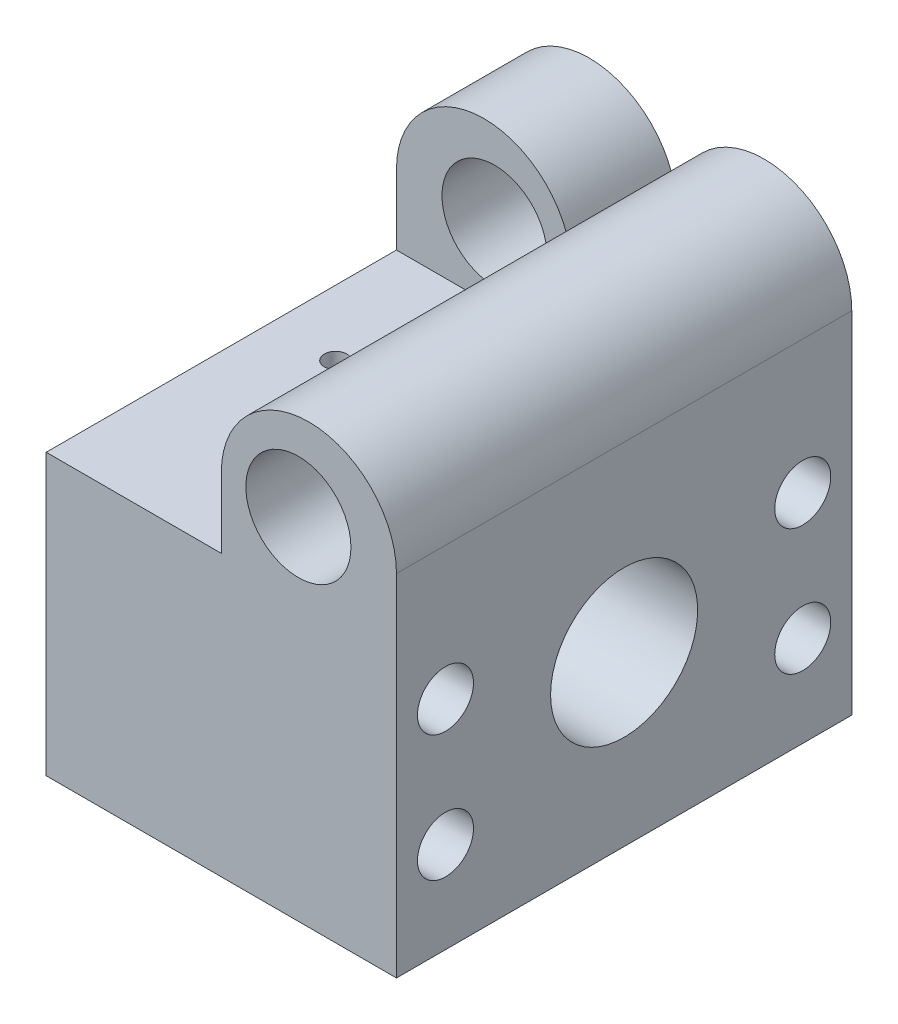
ISO-10303-21;
HEADER;
FILE_DESCRIPTION(('STEP AP214'),'2;1');
FILE_NAME('part.step','',(''),(''),'','','');
FILE_SCHEMA(('AUTOMOTIVE_DESIGN { 1 0 10303 214 1 1 1 1 }'));
ENDSEC;
DATA;
#1=APPLICATION_CONTEXT('core data for automotive mechanical design processes');
#2=APPLICATION_PROTOCOL_DEFINITION('international standard','automotive_design',2000,#1);
#3=PRODUCT_CONTEXT('',#1,'mechanical');
#4=PRODUCT('Part','Part','',(#3));
#5=PRODUCT_RELATED_PRODUCT_CATEGORY('part','',(#4));
#6=PRODUCT_DEFINITION_FORMATION('','',#4);
#7=PRODUCT_DEFINITION_CONTEXT('part definition',#1,'design');
#8=PRODUCT_DEFINITION('design','',#6,#7);
#9=PRODUCT_DEFINITION_SHAPE('','',#8);
#10=(LENGTH_UNIT() NAMED_UNIT(*) SI_UNIT(.MILLI.,.METRE.));
#11=(NAMED_UNIT(*) PLANE_ANGLE_UNIT() SI_UNIT($,.RADIAN.));
#12=(NAMED_UNIT(*) SI_UNIT($,.STERADIAN.) SOLID_ANGLE_UNIT());
#13=UNCERTAINTY_MEASURE_WITH_UNIT(LENGTH_MEASURE(1.E-05),#10,'distance_accuracy_value','');
#14=(GEOMETRIC_REPRESENTATION_CONTEXT(3) GLOBAL_UNCERTAINTY_ASSIGNED_CONTEXT((#13)) GLOBAL_UNIT_ASSIGNED_CONTEXT((#10,
#11,#12)) REPRESENTATION_CONTEXT('',''));
#15=CARTESIAN_POINT('',(0.,0.,0.));
#16=DIRECTION('',(0.,0.,1.));
#17=DIRECTION('',(1.,0.,0.));
#18=AXIS2_PLACEMENT_3D('',#15,#16,#17);
#19=CARTESIAN_POINT('',(50.,24.,32.5));
#20=DIRECTION('',(-1.,0.,0.));
#21=DIRECTION('',(0.,0.,1.));
#22=AXIS2_PLACEMENT_3D('',#19,#20,#21);
#23=CYLINDRICAL_SURFACE('',#22,10.5);
#24=CARTESIAN_POINT('',(50.,24.,32.5));
#25=DIRECTION('',(-1.,0.,0.));
#26=DIRECTION('',(0.,0.,1.));
#27=AXIS2_PLACEMENT_3D('',#24,#25,#26);
#28=CIRCLE('',#27,10.5);
#29=CARTESIAN_POINT('',(50.,24.,43.));
#30=VERTEX_POINT('',#29);
#31=EDGE_CURVE('E181',#30,#30,#28,.T.);
#32=ORIENTED_EDGE('',*,*,#31,.F.);
#33=EDGE_LOOP('',(#32));
#34=FACE_BOUND('',#33,.T.);
#35=CARTESIAN_POINT('',(0.,24.,32.5));
#36=DIRECTION('',(-1.,0.,0.));
#37=DIRECTION('',(0.,0.,1.));
#38=AXIS2_PLACEMENT_3D('',#35,#36,#37);
#39=CIRCLE('',#38,10.5);
#40=CARTESIAN_POINT('',(0.,24.,43.));
#41=VERTEX_POINT('',#40);
#42=EDGE_CURVE('E185',#41,#41,#39,.T.);
#43=ORIENTED_EDGE('',*,*,#42,.T.);
#44=EDGE_LOOP('',(#43));
#45=FACE_BOUND('',#44,.T.);
#46=CARTESIAN_POINT('',(9.30614492508849,13.5577780142347,31.4));
#47=CARTESIAN_POINT('',(9.21649070794788,13.5577766915333,31.4000036185645));
#48=CARTESIAN_POINT('',(9.12678506595959,13.5569730667543,31.4075601543202));
#49=CARTESIAN_POINT('',(8.9498722186539,13.5538764387276,31.4375867941463));
#50=CARTESIAN_POINT('',(8.86266750597175,13.5515820000319,31.4600712722202));
#51=CARTESIAN_POINT('',(8.69333207836679,13.5458577711983,31.5192912321278));
#52=CARTESIAN_POINT('',(8.61119841010018,13.5424286494367,31.5560183266446));
#53=CARTESIAN_POINT('',(8.45426843318534,13.534969176618,31.6426715182522));
#54=CARTESIAN_POINT('',(8.37947097101299,13.5309389203336,31.6925955357204));
#55=CARTESIAN_POINT('',(8.23901669811159,13.5229123950786,31.8044556100075));
#56=CARTESIAN_POINT('',(8.17339446724193,13.5189163052965,31.8664351101119));
#57=CARTESIAN_POINT('',(8.05346471253522,13.5116703918715,32.0005575020169));
#58=CARTESIAN_POINT('',(7.99915744539925,13.5084205851591,32.0727006243361));
#59=CARTESIAN_POINT('',(7.90342373688201,13.5033227554441,32.2251011098934));
#60=CARTESIAN_POINT('',(7.86199384319309,13.5014743565451,32.3053562907026));
#61=CARTESIAN_POINT('',(7.79320008678898,13.4997090698844,32.4717031061238));
#62=CARTESIAN_POINT('',(7.76583537424505,13.4997920654125,32.5577943877583));
#63=CARTESIAN_POINT('',(7.72611490663142,13.5022164212776,32.7326413452297));
#64=CARTESIAN_POINT('',(7.71364497376172,13.5045403514578,32.821371337592));
#65=CARTESIAN_POINT('',(7.70365820580289,13.5115122856108,32.9995751100192));
#66=CARTESIAN_POINT('',(7.70614100756467,13.5161602331389,33.0890488719677));
#67=CARTESIAN_POINT('',(7.72590217256401,13.5276008034479,33.2659598169506));
#68=CARTESIAN_POINT('',(7.74314120894111,13.5343876953761,33.3534017792609));
#69=CARTESIAN_POINT('',(7.79180846892463,13.5497079411446,33.5240818183501));
#70=CARTESIAN_POINT('',(7.82323760268245,13.5582414069908,33.607319625094));
#71=CARTESIAN_POINT('',(7.89975178395241,13.5765459578942,33.768159795755));
#72=CARTESIAN_POINT('',(7.9449718021598,13.5863286930248,33.8456966089386));
#73=CARTESIAN_POINT('',(8.04768617786083,13.6062961663606,33.9921088391691));
#74=CARTESIAN_POINT('',(8.10518158046332,13.6164809387344,34.0609835179403));
#75=CARTESIAN_POINT('',(8.23161287986597,13.6365181429449,34.1889324220307));
#76=CARTESIAN_POINT('',(8.30067107330258,13.6463654988186,34.2478867035686));
#77=CARTESIAN_POINT('',(8.44787340762258,13.6647228478507,34.353354000141));
#78=CARTESIAN_POINT('',(8.52601733299763,13.6732328727185,34.3998673101818));
#79=CARTESIAN_POINT('',(8.68882992701746,13.6880810756535,34.4788744987218));
#80=CARTESIAN_POINT('',(8.77346566577757,13.6944294281002,34.511434245481));
#81=CARTESIAN_POINT('',(8.94716470379116,13.7043926607095,34.5618284135312));
#82=CARTESIAN_POINT('',(9.03622743353633,13.7080078915084,34.5796647237412));
#83=CARTESIAN_POINT('',(9.21454664381583,13.7121071919103,34.5998492213502));
#84=CARTESIAN_POINT('',(9.30377126479093,13.7126460219508,34.6024682930932));
#85=CARTESIAN_POINT('',(9.48137971759433,13.7106869588402,34.59285939418));
#86=CARTESIAN_POINT('',(9.56976359323398,13.7081892248082,34.5806322014834));
#87=CARTESIAN_POINT('',(9.74245927777989,13.7004320528435,34.5418818895807));
#88=CARTESIAN_POINT('',(9.82679802669567,13.6951948895302,34.5154740296373));
#89=CARTESIAN_POINT('',(9.98984595244914,13.6824618829897,34.4492403127997));
#90=CARTESIAN_POINT('',(10.0685547326478,13.6749658808179,34.4094135116491));
#91=CARTESIAN_POINT('',(10.2191869234742,13.6582858893143,34.3169141360585));
#92=CARTESIAN_POINT('',(10.2910137799688,13.649082067695,34.2640879728013));
#93=CARTESIAN_POINT('',(10.4248630825953,13.6298598372766,34.147326898529));
#94=CARTESIAN_POINT('',(10.4868845175892,13.6198413446294,34.0833908432837));
#95=CARTESIAN_POINT('',(10.6004173117673,13.5996647503723,33.9449872813783));
#96=CARTESIAN_POINT('',(10.6517379830925,13.5895070786332,33.8703631533962));
#97=CARTESIAN_POINT('',(10.741116110675,13.5700535730927,33.7134494893357));
#98=CARTESIAN_POINT('',(10.7791734892522,13.5607577443391,33.6311599083662));
#99=CARTESIAN_POINT('',(10.8409190839044,13.5437337905102,33.4611416897174));
#100=CARTESIAN_POINT('',(10.8645989634134,13.5360065766966,33.373409928905));
#101=CARTESIAN_POINT('',(10.8967940687151,13.5226485126188,33.1950521628097));
#102=CARTESIAN_POINT('',(10.9053105412476,13.5170174900351,33.1044263960966));
#103=CARTESIAN_POINT('',(10.9068524868745,13.5081842294233,32.9240863138821));
#104=CARTESIAN_POINT('',(10.9000743134998,13.5049519057117,32.8343751306172));
#105=CARTESIAN_POINT('',(10.8715840207112,13.5008047812624,32.6573033351526));
#106=CARTESIAN_POINT('',(10.849872532568,13.4998898825686,32.5699426237545));
#107=CARTESIAN_POINT('',(10.7923484984986,13.5001305908089,32.4007287267824));
#108=CARTESIAN_POINT('',(10.7566420502023,13.5012708461128,32.3188394056279));
#109=CARTESIAN_POINT('',(10.6721424874499,13.5051434635017,32.1621616887021));
#110=CARTESIAN_POINT('',(10.6233493231354,13.5078758316526,32.0873733199859));
#111=CARTESIAN_POINT('',(10.5137711523678,13.5143548017158,31.9466077273787));
#112=CARTESIAN_POINT('',(10.4529265609792,13.518106479035,31.8806771321469));
#113=CARTESIAN_POINT('',(10.3210877130104,13.5259414208623,31.7598849018022));
#114=CARTESIAN_POINT('',(10.2500910758596,13.5300247630459,31.7050258701753));
#115=CARTESIAN_POINT('',(10.0993968146714,13.5378786866033,31.6075695443324));
#116=CARTESIAN_POINT('',(10.0196409241768,13.5416468382377,31.5650621898442));
#117=CARTESIAN_POINT('',(9.85413775909726,13.5482343158954,31.4940797811387));
#118=CARTESIAN_POINT('',(9.76839645271322,13.5510545712187,31.4655909706074));
#119=CARTESIAN_POINT('',(9.61961005322639,13.5546780843125,31.4297379078773));
#120=CARTESIAN_POINT('',(9.55745508680776,13.5558324166186,31.4186027823446));
#121=CARTESIAN_POINT('',(9.43225686764357,13.5573828444147,31.4037325790874));
#122=CARTESIAN_POINT('',(9.36921362053034,13.5577789447102,31.3999974544628));
#123=CARTESIAN_POINT('',(9.30614492508849,13.5577780142347,31.4));
#124=B_SPLINE_CURVE_WITH_KNOTS('',3,(#46,#47,#48,#49,#50,#51,#52,#53,#54,#55,#56,#57,#58,#59,
#60,#61,#62,#63,#64,#65,#66,#67,#68,#69,#70,#71,#72,#73,#74,#75,#76,#77,#78,#79,#80,#81,#82,#83,
#84,#85,#86,#87,#88,#89,#90,#91,#92,#93,#94,#95,#96,#97,#98,#99,#100,#101,#102,#103,#104,#105,
#106,#107,#108,#109,#110,#111,#112,#113,#114,#115,#116,#117,#118,#119,#120,#121,#122,#123),
.UNSPECIFIED.,.T.,.F.,(4,2,2,2,2,2,2,2,2,2,2,2,2,2,2,2,2,2,2,2,2,2,2,2,2,2,2,2,2,2,2,2,2,2,2,2,
2,2,4),(0.,0.268733138052062,0.53772541323251,0.806559521840576,1.07535129174533,
1.3451302550256,1.61491533807918,1.88462803167781,2.15432442711812,2.42193988422796,
2.68954884193036,2.95644680734145,3.22336189399323,3.49297799001674,3.76261704993317,
4.03531262212496,4.30800172745364,4.57938902338876,4.85074149672749,5.11724842085744,
5.38374138035049,5.64810038601303,5.91247799782378,6.18014336854749,6.44783632302531,
6.71995444478663,6.99207416025368,7.26435150973598,7.53660647145939,7.80538612280978,
8.07415441283274,8.34092336582298,8.60769333517717,8.8758167684723,9.14400317790853,
9.41409609527351,9.68392344087225,9.87296927048751,10.0620139019559),.UNSPECIFIED.);
#125=CARTESIAN_POINT('',(9.30614492508849,13.5577780142347,31.4));
#126=VERTEX_POINT('',#125);
#127=EDGE_CURVE('E138',#126,#126,#124,.T.);
#128=ORIENTED_EDGE('',*,*,#127,.F.);
#129=EDGE_LOOP('',(#128));
#130=FACE_BOUND('',#129,.T.);
#131=CARTESIAN_POINT('',(9.30614492508849,34.4422219857653,31.4));
#132=CARTESIAN_POINT('',(9.39579914222911,34.4422233084667,31.4000036185645));
#133=CARTESIAN_POINT('',(9.4855047842174,34.4430269332457,31.4075601543202));
#134=CARTESIAN_POINT('',(9.66241763152309,34.4461235612724,31.4375867941463));
#135=CARTESIAN_POINT('',(9.74962234420524,34.4484179999681,31.4600712722202));
#136=CARTESIAN_POINT('',(9.9189577718102,34.4541422288017,31.5192912321278));
#137=CARTESIAN_POINT('',(10.0010914400768,34.4575713505633,31.5560183266446));
#138=CARTESIAN_POINT('',(10.1580214169916,34.465030823382,31.6426715182522));
#139=CARTESIAN_POINT('',(10.232818879164,34.4690610796664,31.6925955357204));
#140=CARTESIAN_POINT('',(10.3732731520654,34.4770876049214,31.8044556100075));
#141=CARTESIAN_POINT('',(10.4388953829351,34.4810836947035,31.8664351101119));
#142=CARTESIAN_POINT('',(10.5588251376418,34.4883296081285,32.0005575020169));
#143=CARTESIAN_POINT('',(10.6131324047777,34.4915794148409,32.0727006243361));
#144=CARTESIAN_POINT('',(10.708866113295,34.4966772445559,32.2251011098934));
#145=CARTESIAN_POINT('',(10.7502960069839,34.4985256434549,32.3053562907026));
#146=CARTESIAN_POINT('',(10.819089763388,34.5002909301156,32.4717031061238));
#147=CARTESIAN_POINT('',(10.8464544759319,34.5002079345875,32.5577943877583));
#148=CARTESIAN_POINT('',(10.8861749435456,34.4977835787224,32.7326413452297));
#149=CARTESIAN_POINT('',(10.8986448764153,34.4954596485422,32.821371337592));
#150=CARTESIAN_POINT('',(10.9086316443741,34.4884877143892,32.9995751100192));
#151=CARTESIAN_POINT('',(10.9061488426123,34.4838397668611,33.0890488719677));
#152=CARTESIAN_POINT('',(10.886387677613,34.4723991965521,33.2659598169506));
#153=CARTESIAN_POINT('',(10.8691486412359,34.4656123046239,33.3534017792609));
#154=CARTESIAN_POINT('',(10.8204813812524,34.4502920588554,33.5240818183501));
#155=CARTESIAN_POINT('',(10.7890522474945,34.4417585930092,33.607319625094));
#156=CARTESIAN_POINT('',(10.7125380662246,34.4234540421058,33.768159795755));
#157=CARTESIAN_POINT('',(10.6673180480172,34.4136713069752,33.8456966089386));
#158=CARTESIAN_POINT('',(10.5646036723162,34.3937038336394,33.9921088391691));
#159=CARTESIAN_POINT('',(10.5071082697137,34.3835190612656,34.0609835179403));
#160=CARTESIAN_POINT('',(10.380676970311,34.3634818570551,34.1889324220307));
#161=CARTESIAN_POINT('',(10.3116187768744,34.3536345011814,34.2478867035686));
#162=CARTESIAN_POINT('',(10.1644164425544,34.3352771521494,34.353354000141));
#163=CARTESIAN_POINT('',(10.0862725171794,34.3267671272815,34.3998673101818));
#164=CARTESIAN_POINT('',(9.92345992315953,34.3119189243465,34.4788744987218));
#165=CARTESIAN_POINT('',(9.83882418439942,34.3055705718998,34.511434245481));
#166=CARTESIAN_POINT('',(9.66512514638583,34.2956073392905,34.5618284135312));
#167=CARTESIAN_POINT('',(9.57606241664066,34.2919921084916,34.5796647237412));
#168=CARTESIAN_POINT('',(9.39774320636116,34.2878928080897,34.5998492213502));
#169=CARTESIAN_POINT('',(9.30851858538606,34.2873539780492,34.6024682930932));
#170=CARTESIAN_POINT('',(9.13091013258265,34.2893130411598,34.59285939418));
#171=CARTESIAN_POINT('',(9.04252625694301,34.2918107751918,34.5806322014834));
#172=CARTESIAN_POINT('',(8.8698305723971,34.2995679471565,34.5418818895807));
#173=CARTESIAN_POINT('',(8.78549182348132,34.3048051104698,34.5154740296373));
#174=CARTESIAN_POINT('',(8.62244389772784,34.3175381170103,34.4492403127997));
#175=CARTESIAN_POINT('',(8.54373511752917,34.3250341191821,34.4094135116491));
#176=CARTESIAN_POINT('',(8.39310292670277,34.3417141106857,34.3169141360585));
#177=CARTESIAN_POINT('',(8.32127607020816,34.350917932305,34.2640879728013));
#178=CARTESIAN_POINT('',(8.18742676758171,34.3701401627234,34.147326898529));
#179=CARTESIAN_POINT('',(8.12540533258783,34.3801586553706,34.0833908432837));
#180=CARTESIAN_POINT('',(8.0118725384097,34.4003352496277,33.9449872813783));
#181=CARTESIAN_POINT('',(7.96055186708445,34.4104929213668,33.8703631533962));
#182=CARTESIAN_POINT('',(7.87117373950198,34.4299464269073,33.7134494893357));
#183=CARTESIAN_POINT('',(7.83311636092477,34.4392422556609,33.6311599083662));
#184=CARTESIAN_POINT('',(7.77137076627255,34.4562662094898,33.4611416897174));
#185=CARTESIAN_POINT('',(7.74769088676354,34.4639934233034,33.373409928905));
#186=CARTESIAN_POINT('',(7.71549578146188,34.4773514873812,33.1950521628097));
#187=CARTESIAN_POINT('',(7.70697930892938,34.4829825099649,33.1044263960966));
#188=CARTESIAN_POINT('',(7.70543736330249,34.4918157705767,32.9240863138821));
#189=CARTESIAN_POINT('',(7.71221553667718,34.4950480942883,32.8343751306172));
#190=CARTESIAN_POINT('',(7.74070582946574,34.4991952187376,32.6573033351526));
#191=CARTESIAN_POINT('',(7.76241731760897,34.5001101174314,32.5699426237545));
#192=CARTESIAN_POINT('',(7.8199413516784,34.4998694091911,32.4007287267824));
#193=CARTESIAN_POINT('',(7.85564779997464,34.4987291538872,32.3188394056279));
#194=CARTESIAN_POINT('',(7.94014736272705,34.4948565364983,32.1621616887021));
#195=CARTESIAN_POINT('',(7.98894052704162,34.4921241683474,32.0873733199859));
#196=CARTESIAN_POINT('',(8.0985186978092,34.4856451982842,31.9466077273787));
#197=CARTESIAN_POINT('',(8.15936328919779,34.481893520965,31.8806771321469));
#198=CARTESIAN_POINT('',(8.29120213716662,34.4740585791377,31.7598849018022));
#199=CARTESIAN_POINT('',(8.36219877431742,34.4699752369541,31.7050258701753));
#200=CARTESIAN_POINT('',(8.51289303550564,34.4621213133967,31.6075695443324));
#201=CARTESIAN_POINT('',(8.59264892600017,34.4583531617623,31.5650621898442));
#202=CARTESIAN_POINT('',(8.75815209107973,34.4517656841046,31.4940797811387));
#203=CARTESIAN_POINT('',(8.84389339746376,34.4489454287813,31.4655909706074));
#204=CARTESIAN_POINT('',(8.9926797969506,34.4453219156875,31.4297379078773));
#205=CARTESIAN_POINT('',(9.05483476336923,34.4441675833814,31.4186027823446));
#206=CARTESIAN_POINT('',(9.18003298253342,34.4426171555853,31.4037325790874));
#207=CARTESIAN_POINT('',(9.24307622964665,34.4422210552898,31.3999974544628));
#208=CARTESIAN_POINT('',(9.30614492508849,34.4422219857653,31.4));
#209=B_SPLINE_CURVE_WITH_KNOTS('',3,(#131,#132,#133,#134,#135,#136,#137,#138,#139,#140,#141,
#142,#143,#144,#145,#146,#147,#148,#149,#150,#151,#152,#153,#154,#155,#156,#157,#158,#159,#160,
#161,#162,#163,#164,#165,#166,#167,#168,#169,#170,#171,#172,#173,#174,#175,#176,#177,#178,#179,
#180,#181,#182,#183,#184,#185,#186,#187,#188,#189,#190,#191,#192,#193,#194,#195,#196,#197,#198,
#199,#200,#201,#202,#203,#204,#205,#206,#207,#208),.UNSPECIFIED.,.T.,.F.,(4,2,2,2,2,2,2,2,2,2,2,
2,2,2,2,2,2,2,2,2,2,2,2,2,2,2,2,2,2,2,2,2,2,2,2,2,2,2,4),(0.,0.268733138052062,0.53772541323251,
0.806559521840576,1.07535129174533,1.3451302550256,1.61491533807918,1.88462803167781,
2.15432442711812,2.42193988422796,2.68954884193036,2.95644680734145,3.22336189399323,
3.49297799001674,3.76261704993316,4.03531262212496,4.30800172745364,4.57938902338876,
4.85074149672749,5.11724842085744,5.3837413803505,5.64810038601303,5.91247799782378,
6.18014336854749,6.44783632302532,6.71995444478664,6.99207416025369,7.26435150973599,
7.53660647145939,7.80538612280978,8.07415441283274,8.34092336582298,8.60769333517717,
8.8758167684723,9.14400317790853,9.41409609527351,9.68392344087225,9.87296927048751,
10.0620139019559),.UNSPECIFIED.);
#210=CARTESIAN_POINT('',(9.30614492508849,34.4422219857653,31.4));
#211=VERTEX_POINT('',#210);
#212=EDGE_CURVE('E43',#211,#211,#209,.T.);
#213=ORIENTED_EDGE('',*,*,#212,.F.);
#214=EDGE_LOOP('',(#213));
#215=FACE_BOUND('',#214,.T.);
#216=ADVANCED_FACE('F39',(#34,#45,#130,#215),#23,.F.);
#217=CARTESIAN_POINT('',(36.,50.,0.));
#218=DIRECTION('',(0.,0.,1.));
#219=DIRECTION('',(1.,0.,0.));
#220=AXIS2_PLACEMENT_3D('',#217,#218,#219);
#221=PLANE('',#220);
#222=CARTESIAN_POINT('',(36.,50.,0.));
#223=DIRECTION('',(0.,0.,1.));
#224=DIRECTION('',(1.,0.,0.));
#225=AXIS2_PLACEMENT_3D('',#222,#223,#224);
#226=CIRCLE('',#225,7.5);
#227=CARTESIAN_POINT('',(43.5,50.,0.));
#228=VERTEX_POINT('',#227);
#229=EDGE_CURVE('E259',#228,#228,#226,.T.);
#230=ORIENTED_EDGE('',*,*,#229,.T.);
#231=EDGE_LOOP('',(#230));
#232=FACE_BOUND('',#231,.T.);
#233=CARTESIAN_POINT('',(14.,50.,0.));
#234=DIRECTION('',(0.,0.,1.));
#235=DIRECTION('',(1.,0.,0.));
#236=AXIS2_PLACEMENT_3D('',#233,#234,#235);
#237=CIRCLE('',#236,7.5);
#238=CARTESIAN_POINT('',(21.5,50.,0.));
#239=VERTEX_POINT('',#238);
#240=EDGE_CURVE('E262',#239,#239,#237,.T.);
#241=ORIENTED_EDGE('',*,*,#240,.T.);
#242=EDGE_LOOP('',(#241));
#243=FACE_BOUND('',#242,.T.);
#244=CARTESIAN_POINT('',(37.5,50.,0.));
#245=DIRECTION('',(0.,0.,1.));
#246=DIRECTION('',(1.,0.,0.));
#247=AXIS2_PLACEMENT_3D('',#244,#245,#246);
#248=CIRCLE('',#247,12.5);
#249=CARTESIAN_POINT('',(50.,50.,0.));
#250=VERTEX_POINT('',#249);
#251=CARTESIAN_POINT('',(25.,50.,0.));
#252=VERTEX_POINT('',#251);
#253=EDGE_CURVE('E111',#250,#252,#248,.T.);
#254=ORIENTED_EDGE('',*,*,#253,.F.);
#255=DIRECTION('',(0.,1.,0.));
#256=VECTOR('',#255,1.);
#257=CARTESIAN_POINT('',(50.,0.,0.));
#258=LINE('',#257,#256);
#259=CARTESIAN_POINT('',(50.,0.,0.));
#260=VERTEX_POINT('',#259);
#261=EDGE_CURVE('E125',#260,#250,#258,.T.);
#262=ORIENTED_EDGE('',*,*,#261,.F.);
#263=DIRECTION('',(1.,0.,0.));
#264=VECTOR('',#263,1.);
#265=CARTESIAN_POINT('',(0.,0.,0.));
#266=LINE('',#265,#264);
#267=CARTESIAN_POINT('',(0.,0.,0.));
#268=VERTEX_POINT('',#267);
#269=EDGE_CURVE('E60',#268,#260,#266,.T.);
#270=ORIENTED_EDGE('',*,*,#269,.F.);
#271=DIRECTION('',(0.,-1.,0.));
#272=VECTOR('',#271,1.);
#273=CARTESIAN_POINT('',(0.,50.,0.));
#274=LINE('',#273,#272);
#275=CARTESIAN_POINT('',(0.,50.,0.));
#276=VERTEX_POINT('',#275);
#277=EDGE_CURVE('E68',#276,#268,#274,.T.);
#278=ORIENTED_EDGE('',*,*,#277,.F.);
#279=CARTESIAN_POINT('',(12.5,50.,0.));
#280=DIRECTION('',(0.,0.,1.));
#281=DIRECTION('',(1.,0.,0.));
#282=AXIS2_PLACEMENT_3D('',#279,#280,#281);
#283=CIRCLE('',#282,12.5);
#284=EDGE_CURVE('E126',#276,#252,#283,.F.);
#285=ORIENTED_EDGE('',*,*,#284,.T.);
#286=EDGE_LOOP('',(#254,#262,#270,#278,#285));
#287=FACE_BOUND('',#286,.T.);
#288=ADVANCED_FACE('F124',(#232,#243,#287),#221,.F.);
#289=CARTESIAN_POINT('',(36.,50.,15.));
#290=DIRECTION('',(0.,0.,1.));
#291=DIRECTION('',(1.,0.,0.));
#292=AXIS2_PLACEMENT_3D('',#289,#290,#291);
#293=PLANE('',#292);
#294=CARTESIAN_POINT('',(12.5,50.,15.));
#295=DIRECTION('',(0.,0.,1.));
#296=DIRECTION('',(1.,0.,0.));
#297=AXIS2_PLACEMENT_3D('',#294,#295,#296);
#298=CIRCLE('',#297,12.5);
#299=CARTESIAN_POINT('',(0.,50.,15.));
#300=VERTEX_POINT('',#299);
#301=CARTESIAN_POINT('',(25.,50.,15.));
#302=VERTEX_POINT('',#301);
#303=EDGE_CURVE('E127',#300,#302,#298,.F.);
#304=ORIENTED_EDGE('',*,*,#303,.F.);
#305=DIRECTION('',(0.,-1.,0.));
#306=VECTOR('',#305,1.);
#307=CARTESIAN_POINT('',(0.,50.,15.));
#308=LINE('',#307,#306);
#309=CARTESIAN_POINT('',(0.,40.,15.));
#310=VERTEX_POINT('',#309);
#311=EDGE_CURVE('E130',#300,#310,#308,.T.);
#312=ORIENTED_EDGE('',*,*,#311,.T.);
#313=DIRECTION('',(-1.,0.,0.));
#314=VECTOR('',#313,1.);
#315=CARTESIAN_POINT('',(36.,40.,15.));
#316=LINE('',#315,#314);
#317=CARTESIAN_POINT('',(25.,40.,15.));
#318=VERTEX_POINT('',#317);
#319=EDGE_CURVE('E239',#318,#310,#316,.T.);
#320=ORIENTED_EDGE('',*,*,#319,.F.);
#321=DIRECTION('',(0.,-1.,0.));
#322=VECTOR('',#321,1.);
#323=CARTESIAN_POINT('',(25.,0.,15.));
#324=LINE('',#323,#322);
#325=EDGE_CURVE('E241',#302,#318,#324,.T.);
#326=ORIENTED_EDGE('',*,*,#325,.F.);
#327=EDGE_LOOP('',(#304,#312,#320,#326));
#328=FACE_BOUND('',#327,.T.);
#329=CARTESIAN_POINT('',(14.,50.,15.));
#330=DIRECTION('',(0.,0.,1.));
#331=DIRECTION('',(1.,0.,0.));
#332=AXIS2_PLACEMENT_3D('',#329,#330,#331);
#333=CIRCLE('',#332,7.5);
#334=CARTESIAN_POINT('',(21.5,50.,15.));
#335=VERTEX_POINT('',#334);
#336=EDGE_CURVE('E263',#335,#335,#333,.T.);
#337=ORIENTED_EDGE('',*,*,#336,.F.);
#338=EDGE_LOOP('',(#337));
#339=FACE_BOUND('',#338,.T.);
#340=ADVANCED_FACE('F175',(#328,#339),#293,.T.);
#341=CARTESIAN_POINT('',(0.,50.,15.));
#342=DIRECTION('',(1.,0.,0.));
#343=DIRECTION('',(0.,0.,-1.));
#344=AXIS2_PLACEMENT_3D('',#341,#342,#343);
#345=PLANE('',#344);
#346=CARTESIAN_POINT('',(0.,13.,7.));
#347=DIRECTION('',(-1.,0.,0.));
#348=DIRECTION('',(0.,0.,1.));
#349=AXIS2_PLACEMENT_3D('',#346,#347,#348);
#350=CIRCLE('',#349,4.);
#351=CARTESIAN_POINT('',(0.,13.,11.));
#352=VERTEX_POINT('',#351);
#353=EDGE_CURVE('E211',#352,#352,#350,.T.);
#354=ORIENTED_EDGE('',*,*,#353,.F.);
#355=EDGE_LOOP('',(#354));
#356=FACE_BOUND('',#355,.T.);
#357=CARTESIAN_POINT('',(0.,31.,58.));
#358=DIRECTION('',(-1.,0.,0.));
#359=DIRECTION('',(0.,0.,1.));
#360=AXIS2_PLACEMENT_3D('',#357,#358,#359);
#361=CIRCLE('',#360,4.);
#362=CARTESIAN_POINT('',(0.,31.,62.));
#363=VERTEX_POINT('',#362);
#364=EDGE_CURVE('E202',#363,#363,#361,.T.);
#365=ORIENTED_EDGE('',*,*,#364,.F.);
#366=EDGE_LOOP('',(#365));
#367=FACE_BOUND('',#366,.T.);
#368=CARTESIAN_POINT('',(0.,31.,7.));
#369=DIRECTION('',(-1.,0.,0.));
#370=DIRECTION('',(0.,0.,1.));
#371=AXIS2_PLACEMENT_3D('',#368,#369,#370);
#372=CIRCLE('',#371,4.);
#373=CARTESIAN_POINT('',(0.,31.,11.));
#374=VERTEX_POINT('',#373);
#375=EDGE_CURVE('E203',#374,#374,#372,.T.);
#376=ORIENTED_EDGE('',*,*,#375,.F.);
#377=EDGE_LOOP('',(#376));
#378=FACE_BOUND('',#377,.T.);
#379=ORIENTED_EDGE('',*,*,#42,.F.);
#380=EDGE_LOOP('',(#379));
#381=FACE_BOUND('',#380,.T.);
#382=CARTESIAN_POINT('',(0.,13.,58.));
#383=DIRECTION('',(-1.,0.,0.));
#384=DIRECTION('',(0.,0.,1.));
#385=AXIS2_PLACEMENT_3D('',#382,#383,#384);
#386=CIRCLE('',#385,4.);
#387=CARTESIAN_POINT('',(0.,13.,62.));
#388=VERTEX_POINT('',#387);
#389=EDGE_CURVE('E210',#388,#388,#386,.T.);
#390=ORIENTED_EDGE('',*,*,#389,.F.);
#391=EDGE_LOOP('',(#390));
#392=FACE_BOUND('',#391,.T.);
#393=ORIENTED_EDGE('',*,*,#277,.T.);
#394=DIRECTION('',(0.,0.,-1.));
#395=VECTOR('',#394,1.);
#396=CARTESIAN_POINT('',(0.,0.,15.));
#397=LINE('',#396,#395);
#398=CARTESIAN_POINT('',(0.,0.,65.));
#399=VERTEX_POINT('',#398);
#400=EDGE_CURVE('E11',#399,#268,#397,.T.);
#401=ORIENTED_EDGE('',*,*,#400,.F.);
#402=DIRECTION('',(0.,1.,0.));
#403=VECTOR('',#402,1.);
#404=CARTESIAN_POINT('',(0.,0.,65.));
#405=LINE('',#404,#403);
#406=CARTESIAN_POINT('',(0.,40.,65.));
#407=VERTEX_POINT('',#406);
#408=EDGE_CURVE('E228',#399,#407,#405,.T.);
#409=ORIENTED_EDGE('',*,*,#408,.T.);
#410=DIRECTION('',(0.,0.,-1.));
#411=VECTOR('',#410,1.);
#412=CARTESIAN_POINT('',(0.,40.,65.));
#413=LINE('',#412,#411);
#414=EDGE_CURVE('E233',#407,#310,#413,.T.);
#415=ORIENTED_EDGE('',*,*,#414,.T.);
#416=ORIENTED_EDGE('',*,*,#311,.F.);
#417=DIRECTION('',(0.,0.,-1.));
#418=VECTOR('',#417,1.);
#419=CARTESIAN_POINT('',(0.,50.,15.));
#420=LINE('',#419,#418);
#421=EDGE_CURVE('E119',#300,#276,#420,.T.);
#422=ORIENTED_EDGE('',*,*,#421,.T.);
#423=EDGE_LOOP('',(#393,#401,#409,#415,#416,#422));
#424=FACE_BOUND('',#423,.T.);
#425=ADVANCED_FACE('F41',(#356,#367,#378,#381,#392,#424),#345,.F.);
#426=CARTESIAN_POINT('',(0.,0.,15.));
#427=DIRECTION('',(0.,1.,0.));
#428=DIRECTION('',(0.,0.,1.));
#429=AXIS2_PLACEMENT_3D('',#426,#427,#428);
#430=PLANE('',#429);
#431=CARTESIAN_POINT('',(9.30614492508849,0.,33.));
#432=DIRECTION('',(0.,1.,0.));
#433=DIRECTION('',(0.,0.,1.));
#434=AXIS2_PLACEMENT_3D('',#431,#432,#433);
#435=CIRCLE('',#434,1.6);
#436=CARTESIAN_POINT('',(9.30614492508849,0.,34.6));
#437=VERTEX_POINT('',#436);
#438=EDGE_CURVE('E143',#437,#437,#435,.T.);
#439=ORIENTED_EDGE('',*,*,#438,.T.);
#440=EDGE_LOOP('',(#439));
#441=FACE_BOUND('',#440,.T.);
#442=ORIENTED_EDGE('',*,*,#269,.T.);
#443=DIRECTION('',(0.,0.,-1.));
#444=VECTOR('',#443,1.);
#445=CARTESIAN_POINT('',(50.,0.,15.));
#446=LINE('',#445,#444);
#447=CARTESIAN_POINT('',(50.,0.,65.));
#448=VERTEX_POINT('',#447);
#449=EDGE_CURVE('E53',#448,#260,#446,.T.);
#450=ORIENTED_EDGE('',*,*,#449,.F.);
#451=DIRECTION('',(1.,0.,0.));
#452=VECTOR('',#451,1.);
#453=CARTESIAN_POINT('',(0.,0.,65.));
#454=LINE('',#453,#452);
#455=EDGE_CURVE('E251',#399,#448,#454,.T.);
#456=ORIENTED_EDGE('',*,*,#455,.F.);
#457=ORIENTED_EDGE('',*,*,#400,.T.);
#458=EDGE_LOOP('',(#442,#450,#456,#457));
#459=FACE_BOUND('',#458,.T.);
#460=ADVANCED_FACE('F281',(#441,#459),#430,.F.);
#461=CARTESIAN_POINT('',(50.,0.,15.));
#462=DIRECTION('',(-1.,0.,0.));
#463=DIRECTION('',(0.,0.,1.));
#464=AXIS2_PLACEMENT_3D('',#461,#462,#463);
#465=PLANE('',#464);
#466=CARTESIAN_POINT('',(50.,13.,7.));
#467=DIRECTION('',(-1.,0.,0.));
#468=DIRECTION('',(0.,0.,1.));
#469=AXIS2_PLACEMENT_3D('',#466,#467,#468);
#470=CIRCLE('',#469,4.);
#471=CARTESIAN_POINT('',(50.,13.,11.));
#472=VERTEX_POINT('',#471);
#473=EDGE_CURVE('E207',#472,#472,#470,.T.);
#474=ORIENTED_EDGE('',*,*,#473,.T.);
#475=EDGE_LOOP('',(#474));
#476=FACE_BOUND('',#475,.T.);
#477=CARTESIAN_POINT('',(50.,31.,58.));
#478=DIRECTION('',(-1.,0.,0.));
#479=DIRECTION('',(0.,0.,1.));
#480=AXIS2_PLACEMENT_3D('',#477,#478,#479);
#481=CIRCLE('',#480,4.);
#482=CARTESIAN_POINT('',(50.,31.,62.));
#483=VERTEX_POINT('',#482);
#484=EDGE_CURVE('E214',#483,#483,#481,.T.);
#485=ORIENTED_EDGE('',*,*,#484,.T.);
#486=EDGE_LOOP('',(#485));
#487=FACE_BOUND('',#486,.T.);
#488=CARTESIAN_POINT('',(50.,31.,7.));
#489=DIRECTION('',(-1.,0.,0.));
#490=DIRECTION('',(0.,0.,1.));
#491=AXIS2_PLACEMENT_3D('',#488,#489,#490);
#492=CIRCLE('',#491,4.);
#493=CARTESIAN_POINT('',(50.,31.,11.));
#494=VERTEX_POINT('',#493);
#495=EDGE_CURVE('E199',#494,#494,#492,.T.);
#496=ORIENTED_EDGE('',*,*,#495,.T.);
#497=EDGE_LOOP('',(#496));
#498=FACE_BOUND('',#497,.T.);
#499=ORIENTED_EDGE('',*,*,#31,.T.);
#500=EDGE_LOOP('',(#499));
#501=FACE_BOUND('',#500,.T.);
#502=CARTESIAN_POINT('',(50.,13.,58.));
#503=DIRECTION('',(-1.,0.,0.));
#504=DIRECTION('',(0.,0.,1.));
#505=AXIS2_PLACEMENT_3D('',#502,#503,#504);
#506=CIRCLE('',#505,4.);
#507=CARTESIAN_POINT('',(50.,13.,62.));
#508=VERTEX_POINT('',#507);
#509=EDGE_CURVE('E219',#508,#508,#506,.T.);
#510=ORIENTED_EDGE('',*,*,#509,.T.);
#511=EDGE_LOOP('',(#510));
#512=FACE_BOUND('',#511,.T.);
#513=DIRECTION('',(0.,0.,-1.));
#514=VECTOR('',#513,1.);
#515=CARTESIAN_POINT('',(50.,50.,15.));
#516=LINE('',#515,#514);
#517=CARTESIAN_POINT('',(50.,50.,65.));
#518=VERTEX_POINT('',#517);
#519=EDGE_CURVE('E107',#518,#250,#516,.T.);
#520=ORIENTED_EDGE('',*,*,#519,.F.);
#521=DIRECTION('',(0.,1.,0.));
#522=VECTOR('',#521,1.);
#523=CARTESIAN_POINT('',(50.,0.,65.));
#524=LINE('',#523,#522);
#525=EDGE_CURVE('E245',#448,#518,#524,.T.);
#526=ORIENTED_EDGE('',*,*,#525,.F.);
#527=ORIENTED_EDGE('',*,*,#449,.T.);
#528=ORIENTED_EDGE('',*,*,#261,.T.);
#529=EDGE_LOOP('',(#520,#526,#527,#528));
#530=FACE_BOUND('',#529,.T.);
#531=ADVANCED_FACE('F129',(#476,#487,#498,#501,#512,#530),#465,.F.);
#532=CARTESIAN_POINT('',(14.,50.,15.));
#533=DIRECTION('',(0.,0.,-1.));
#534=DIRECTION('',(-1.,0.,0.));
#535=AXIS2_PLACEMENT_3D('',#532,#533,#534);
#536=CYLINDRICAL_SURFACE('',#535,7.5);
#537=ORIENTED_EDGE('',*,*,#336,.T.);
#538=EDGE_LOOP('',(#537));
#539=FACE_BOUND('',#538,.T.);
#540=ORIENTED_EDGE('',*,*,#240,.F.);
#541=EDGE_LOOP('',(#540));
#542=FACE_BOUND('',#541,.T.);
#543=ADVANCED_FACE('F270',(#539,#542),#536,.F.);
#544=CARTESIAN_POINT('',(36.,50.,15.));
#545=DIRECTION('',(0.,0.,-1.));
#546=DIRECTION('',(-1.,0.,0.));
#547=AXIS2_PLACEMENT_3D('',#544,#545,#546);
#548=CYLINDRICAL_SURFACE('',#547,7.5);
#549=ORIENTED_EDGE('',*,*,#229,.F.);
#550=EDGE_LOOP('',(#549));
#551=FACE_BOUND('',#550,.T.);
#552=CARTESIAN_POINT('',(36.,50.,65.));
#553=DIRECTION('',(0.,0.,1.));
#554=DIRECTION('',(1.,0.,0.));
#555=AXIS2_PLACEMENT_3D('',#552,#553,#554);
#556=CIRCLE('',#555,7.5);
#557=CARTESIAN_POINT('',(43.5,50.,65.));
#558=VERTEX_POINT('',#557);
#559=EDGE_CURVE('E242',#558,#558,#556,.F.);
#560=ORIENTED_EDGE('',*,*,#559,.F.);
#561=EDGE_LOOP('',(#560));
#562=FACE_BOUND('',#561,.T.);
#563=ADVANCED_FACE('F272',(#551,#562),#548,.F.);
#564=CARTESIAN_POINT('',(37.5,50.,65.));
#565=DIRECTION('',(0.,0.,-1.));
#566=DIRECTION('',(-1.,0.,0.));
#567=AXIS2_PLACEMENT_3D('',#564,#565,#566);
#568=CYLINDRICAL_SURFACE('',#567,12.5);
#569=CARTESIAN_POINT('',(37.5,50.,65.));
#570=DIRECTION('',(0.,0.,1.));
#571=DIRECTION('',(1.,0.,0.));
#572=AXIS2_PLACEMENT_3D('',#569,#570,#571);
#573=CIRCLE('',#572,12.5);
#574=CARTESIAN_POINT('',(25.,50.,65.));
#575=VERTEX_POINT('',#574);
#576=EDGE_CURVE('E114',#518,#575,#573,.T.);
#577=ORIENTED_EDGE('',*,*,#576,.F.);
#578=ORIENTED_EDGE('',*,*,#519,.T.);
#579=ORIENTED_EDGE('',*,*,#253,.T.);
#580=DIRECTION('',(0.,0.,1.));
#581=VECTOR('',#580,1.);
#582=CARTESIAN_POINT('',(25.,50.,0.));
#583=LINE('',#582,#581);
#584=EDGE_CURVE('E225',#252,#302,#583,.T.);
#585=ORIENTED_EDGE('',*,*,#584,.T.);
#586=DIRECTION('',(0.,0.,-1.));
#587=VECTOR('',#586,1.);
#588=CARTESIAN_POINT('',(25.,50.,65.));
#589=LINE('',#588,#587);
#590=EDGE_CURVE('E254',#575,#302,#589,.T.);
#591=ORIENTED_EDGE('',*,*,#590,.F.);
#592=EDGE_LOOP('',(#577,#578,#579,#585,#591));
#593=FACE_BOUND('',#592,.T.);
#594=ADVANCED_FACE('F109',(#593),#568,.T.);
#595=CARTESIAN_POINT('',(25.,0.,65.));
#596=DIRECTION('',(1.,0.,0.));
#597=DIRECTION('',(0.,0.,-1.));
#598=AXIS2_PLACEMENT_3D('',#595,#596,#597);
#599=PLANE('',#598);
#600=ORIENTED_EDGE('',*,*,#325,.T.);
#601=DIRECTION('',(0.,0.,1.));
#602=VECTOR('',#601,1.);
#603=CARTESIAN_POINT('',(25.,40.,65.));
#604=LINE('',#603,#602);
#605=CARTESIAN_POINT('',(25.,40.,65.));
#606=VERTEX_POINT('',#605);
#607=EDGE_CURVE('E236',#318,#606,#604,.T.);
#608=ORIENTED_EDGE('',*,*,#607,.T.);
#609=DIRECTION('',(0.,-1.,0.));
#610=VECTOR('',#609,1.);
#611=CARTESIAN_POINT('',(25.,0.,65.));
#612=LINE('',#611,#610);
#613=EDGE_CURVE('E248',#575,#606,#612,.T.);
#614=ORIENTED_EDGE('',*,*,#613,.F.);
#615=ORIENTED_EDGE('',*,*,#590,.T.);
#616=EDGE_LOOP('',(#600,#608,#614,#615));
#617=FACE_BOUND('',#616,.T.);
#618=ADVANCED_FACE('F317',(#617),#599,.F.);
#619=CARTESIAN_POINT('',(0.,0.,65.));
#620=DIRECTION('',(0.,0.,1.));
#621=DIRECTION('',(1.,0.,0.));
#622=AXIS2_PLACEMENT_3D('',#619,#620,#621);
#623=PLANE('',#622);
#624=ORIENTED_EDGE('',*,*,#613,.T.);
#625=DIRECTION('',(1.,0.,0.));
#626=VECTOR('',#625,1.);
#627=CARTESIAN_POINT('',(50.,40.,65.));
#628=LINE('',#627,#626);
#629=EDGE_CURVE('E231',#407,#606,#628,.T.);
#630=ORIENTED_EDGE('',*,*,#629,.F.);
#631=ORIENTED_EDGE('',*,*,#408,.F.);
#632=ORIENTED_EDGE('',*,*,#455,.T.);
#633=ORIENTED_EDGE('',*,*,#525,.T.);
#634=ORIENTED_EDGE('',*,*,#576,.T.);
#635=EDGE_LOOP('',(#624,#630,#631,#632,#633,#634));
#636=FACE_BOUND('',#635,.T.);
#637=ORIENTED_EDGE('',*,*,#559,.T.);
#638=EDGE_LOOP('',(#637));
#639=FACE_BOUND('',#638,.T.);
#640=ADVANCED_FACE('F314',(#636,#639),#623,.T.);
#641=CARTESIAN_POINT('',(50.,40.,65.));
#642=DIRECTION('',(0.,1.,0.));
#643=DIRECTION('',(0.,0.,1.));
#644=AXIS2_PLACEMENT_3D('',#641,#642,#643);
#645=PLANE('',#644);
#646=CARTESIAN_POINT('',(9.30614492508849,40.,33.));
#647=DIRECTION('',(0.,1.,0.));
#648=DIRECTION('',(0.,0.,1.));
#649=AXIS2_PLACEMENT_3D('',#646,#647,#648);
#650=CIRCLE('',#649,1.6);
#651=CARTESIAN_POINT('',(9.30614492508849,40.,34.6));
#652=VERTEX_POINT('',#651);
#653=EDGE_CURVE('E191',#652,#652,#650,.F.);
#654=ORIENTED_EDGE('',*,*,#653,.T.);
#655=EDGE_LOOP('',(#654));
#656=FACE_BOUND('',#655,.T.);
#657=ORIENTED_EDGE('',*,*,#607,.F.);
#658=ORIENTED_EDGE('',*,*,#319,.T.);
#659=ORIENTED_EDGE('',*,*,#414,.F.);
#660=ORIENTED_EDGE('',*,*,#629,.T.);
#661=EDGE_LOOP('',(#657,#658,#659,#660));
#662=FACE_BOUND('',#661,.T.);
#663=ADVANCED_FACE('F310',(#656,#662),#645,.T.);
#664=CARTESIAN_POINT('',(12.5,50.,0.));
#665=DIRECTION('',(0.,0.,1.));
#666=DIRECTION('',(1.,0.,0.));
#667=AXIS2_PLACEMENT_3D('',#664,#665,#666);
#668=CYLINDRICAL_SURFACE('',#667,12.5);
#669=ORIENTED_EDGE('',*,*,#303,.T.);
#670=ORIENTED_EDGE('',*,*,#584,.F.);
#671=ORIENTED_EDGE('',*,*,#284,.F.);
#672=ORIENTED_EDGE('',*,*,#421,.F.);
#673=EDGE_LOOP('',(#669,#670,#671,#672));
#674=FACE_BOUND('',#673,.T.);
#675=ADVANCED_FACE('F165',(#674),#668,.T.);
#676=CARTESIAN_POINT('',(50.,13.,58.));
#677=DIRECTION('',(-1.,0.,0.));
#678=DIRECTION('',(0.,0.,1.));
#679=AXIS2_PLACEMENT_3D('',#676,#677,#678);
#680=CYLINDRICAL_SURFACE('',#679,4.);
#681=ORIENTED_EDGE('',*,*,#509,.F.);
#682=EDGE_LOOP('',(#681));
#683=FACE_BOUND('',#682,.T.);
#684=ORIENTED_EDGE('',*,*,#389,.T.);
#685=EDGE_LOOP('',(#684));
#686=FACE_BOUND('',#685,.T.);
#687=ADVANCED_FACE('F156',(#683,#686),#680,.F.);
#688=CARTESIAN_POINT('',(50.,31.,7.));
#689=DIRECTION('',(-1.,0.,0.));
#690=DIRECTION('',(0.,0.,1.));
#691=AXIS2_PLACEMENT_3D('',#688,#689,#690);
#692=CYLINDRICAL_SURFACE('',#691,4.);
#693=ORIENTED_EDGE('',*,*,#495,.F.);
#694=EDGE_LOOP('',(#693));
#695=FACE_BOUND('',#694,.T.);
#696=ORIENTED_EDGE('',*,*,#375,.T.);
#697=EDGE_LOOP('',(#696));
#698=FACE_BOUND('',#697,.T.);
#699=ADVANCED_FACE('F152',(#695,#698),#692,.F.);
#700=CARTESIAN_POINT('',(50.,31.,58.));
#701=DIRECTION('',(-1.,0.,0.));
#702=DIRECTION('',(0.,0.,1.));
#703=AXIS2_PLACEMENT_3D('',#700,#701,#702);
#704=CYLINDRICAL_SURFACE('',#703,4.);
#705=ORIENTED_EDGE('',*,*,#484,.F.);
#706=EDGE_LOOP('',(#705));
#707=FACE_BOUND('',#706,.T.);
#708=ORIENTED_EDGE('',*,*,#364,.T.);
#709=EDGE_LOOP('',(#708));
#710=FACE_BOUND('',#709,.T.);
#711=ADVANCED_FACE('F155',(#707,#710),#704,.F.);
#712=CARTESIAN_POINT('',(50.,13.,7.));
#713=DIRECTION('',(-1.,0.,0.));
#714=DIRECTION('',(0.,0.,1.));
#715=AXIS2_PLACEMENT_3D('',#712,#713,#714);
#716=CYLINDRICAL_SURFACE('',#715,4.);
#717=ORIENTED_EDGE('',*,*,#473,.F.);
#718=EDGE_LOOP('',(#717));
#719=FACE_BOUND('',#718,.T.);
#720=ORIENTED_EDGE('',*,*,#353,.T.);
#721=EDGE_LOOP('',(#720));
#722=FACE_BOUND('',#721,.T.);
#723=ADVANCED_FACE('F162',(#719,#722),#716,.F.);
#724=CARTESIAN_POINT('',(9.30614492508849,62.5,33.));
#725=DIRECTION('',(0.,-1.,0.));
#726=DIRECTION('',(0.,0.,-1.));
#727=AXIS2_PLACEMENT_3D('',#724,#725,#726);
#728=CYLINDRICAL_SURFACE('',#727,1.6);
#729=ORIENTED_EDGE('',*,*,#438,.F.);
#730=EDGE_LOOP('',(#729));
#731=FACE_BOUND('',#730,.T.);
#732=ORIENTED_EDGE('',*,*,#127,.T.);
#733=EDGE_LOOP('',(#732));
#734=FACE_BOUND('',#733,.T.);
#735=ADVANCED_FACE('F150',(#731,#734),#728,.F.);
#736=ORIENTED_EDGE('',*,*,#653,.F.);
#737=EDGE_LOOP('',(#736));
#738=FACE_BOUND('',#737,.T.);
#739=ORIENTED_EDGE('',*,*,#212,.T.);
#740=EDGE_LOOP('',(#739));
#741=FACE_BOUND('',#740,.T.);
#742=ADVANCED_FACE('F147',(#738,#741),#728,.F.);
#743=CLOSED_SHELL('',(#216,#288,#340,#425,#460,#531,#543,#563,#594,#618,#640,#663,#675,#687,
#699,#711,#723,#735,#742));
#744=MANIFOLD_SOLID_BREP('B2',#743);
#745=ADVANCED_BREP_SHAPE_REPRESENTATION('',(#18,#744),#14);
#746=SHAPE_DEFINITION_REPRESENTATION(#9,#745);
ENDSEC;
END-ISO-10303-21;
